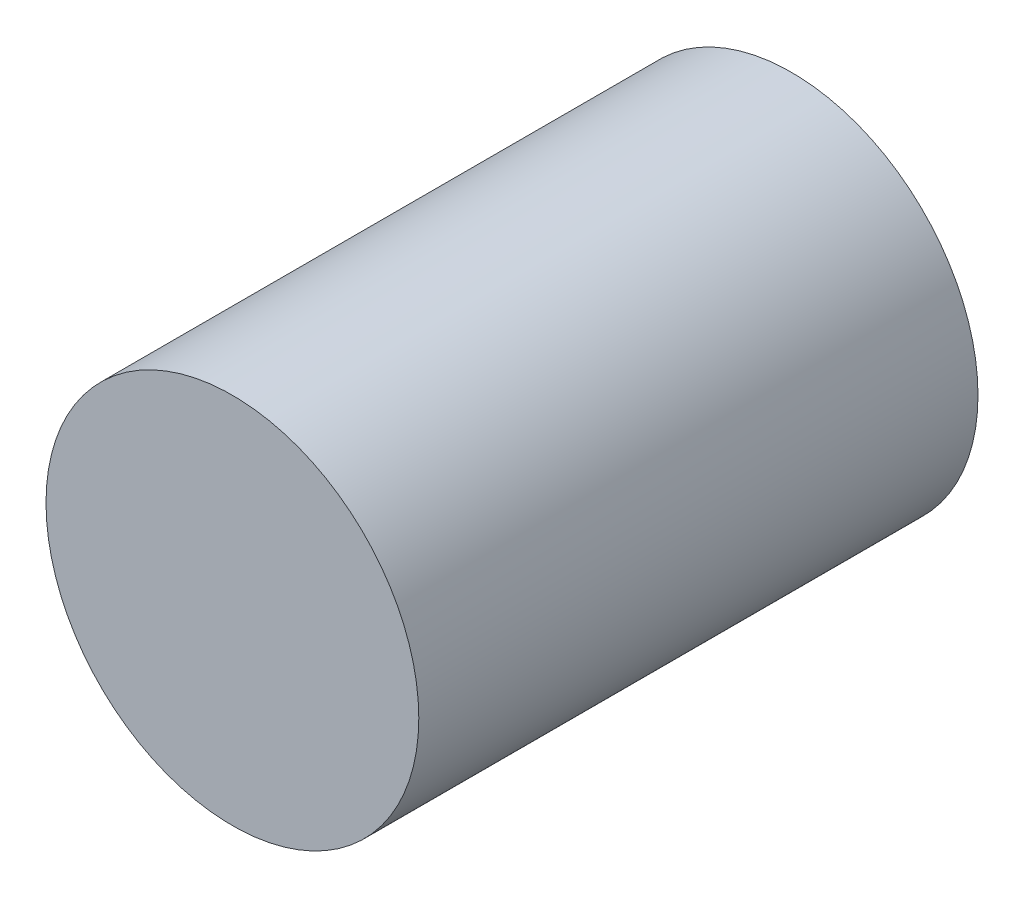
ISO-10303-21;
HEADER;
FILE_DESCRIPTION(('STEP AP214'),'2;1');
FILE_NAME('part.step','',(''),(''),'','','');
FILE_SCHEMA(('AUTOMOTIVE_DESIGN { 1 0 10303 214 1 1 1 1 }'));
ENDSEC;
DATA;
#1=APPLICATION_CONTEXT('core data for automotive mechanical design processes');
#2=APPLICATION_PROTOCOL_DEFINITION('international standard','automotive_design',2000,#1);
#3=PRODUCT_CONTEXT('',#1,'mechanical');
#4=PRODUCT('Part','Part','',(#3));
#5=PRODUCT_RELATED_PRODUCT_CATEGORY('part','',(#4));
#6=PRODUCT_DEFINITION_FORMATION('','',#4);
#7=PRODUCT_DEFINITION_CONTEXT('part definition',#1,'design');
#8=PRODUCT_DEFINITION('design','',#6,#7);
#9=PRODUCT_DEFINITION_SHAPE('','',#8);
#10=(LENGTH_UNIT() NAMED_UNIT(*) SI_UNIT(.MILLI.,.METRE.));
#11=(NAMED_UNIT(*) PLANE_ANGLE_UNIT() SI_UNIT($,.RADIAN.));
#12=(NAMED_UNIT(*) SI_UNIT($,.STERADIAN.) SOLID_ANGLE_UNIT());
#13=UNCERTAINTY_MEASURE_WITH_UNIT(LENGTH_MEASURE(1.E-05),#10,'distance_accuracy_value','');
#14=(GEOMETRIC_REPRESENTATION_CONTEXT(3) GLOBAL_UNCERTAINTY_ASSIGNED_CONTEXT((#13)) GLOBAL_UNIT_ASSIGNED_CONTEXT((#10,
#11,#12)) REPRESENTATION_CONTEXT('',''));
#15=CARTESIAN_POINT('',(0.,0.,0.));
#16=DIRECTION('',(0.,0.,1.));
#17=DIRECTION('',(1.,0.,0.));
#18=AXIS2_PLACEMENT_3D('',#15,#16,#17);
#19=CARTESIAN_POINT('',(0.,0.,457.2));
#20=DIRECTION('',(0.,0.,-1.));
#21=DIRECTION('',(-1.,0.,0.));
#22=AXIS2_PLACEMENT_3D('',#19,#20,#21);
#23=CYLINDRICAL_SURFACE('',#22,152.4);
#24=CARTESIAN_POINT('',(0.,0.,457.2));
#25=DIRECTION('',(0.,0.,1.));
#26=DIRECTION('',(1.,0.,0.));
#27=AXIS2_PLACEMENT_3D('',#24,#25,#26);
#28=CIRCLE('',#27,152.4);
#29=CARTESIAN_POINT('',(152.4,0.,457.2));
#30=VERTEX_POINT('',#29);
#31=EDGE_CURVE('E10',#30,#30,#28,.T.);
#32=ORIENTED_EDGE('',*,*,#31,.F.);
#33=EDGE_LOOP('',(#32));
#34=FACE_BOUND('',#33,.T.);
#35=CARTESIAN_POINT('',(0.,0.,0.));
#36=DIRECTION('',(0.,0.,1.));
#37=DIRECTION('',(1.,0.,0.));
#38=AXIS2_PLACEMENT_3D('',#35,#36,#37);
#39=CIRCLE('',#38,152.4);
#40=CARTESIAN_POINT('',(152.4,0.,0.));
#41=VERTEX_POINT('',#40);
#42=EDGE_CURVE('E37',#41,#41,#39,.T.);
#43=ORIENTED_EDGE('',*,*,#42,.T.);
#44=EDGE_LOOP('',(#43));
#45=FACE_BOUND('',#44,.T.);
#46=ADVANCED_FACE('F34',(#34,#45),#23,.T.);
#47=CARTESIAN_POINT('',(0.,0.,457.2));
#48=DIRECTION('',(0.,0.,1.));
#49=DIRECTION('',(1.,0.,0.));
#50=AXIS2_PLACEMENT_3D('',#47,#48,#49);
#51=PLANE('',#50);
#52=ORIENTED_EDGE('',*,*,#31,.T.);
#53=EDGE_LOOP('',(#52));
#54=FACE_BOUND('',#53,.T.);
#55=ADVANCED_FACE('F49',(#54),#51,.T.);
#56=CARTESIAN_POINT('',(0.,0.,0.));
#57=DIRECTION('',(0.,0.,1.));
#58=DIRECTION('',(1.,0.,0.));
#59=AXIS2_PLACEMENT_3D('',#56,#57,#58);
#60=PLANE('',#59);
#61=ORIENTED_EDGE('',*,*,#42,.F.);
#62=EDGE_LOOP('',(#61));
#63=FACE_BOUND('',#62,.T.);
#64=ADVANCED_FACE('F47',(#63),#60,.F.);
#65=CLOSED_SHELL('',(#46,#55,#64));
#66=MANIFOLD_SOLID_BREP('B2',#65);
#67=ADVANCED_BREP_SHAPE_REPRESENTATION('',(#18,#66),#14);
#68=SHAPE_DEFINITION_REPRESENTATION(#9,#67);
ENDSEC;
END-ISO-10303-21;
